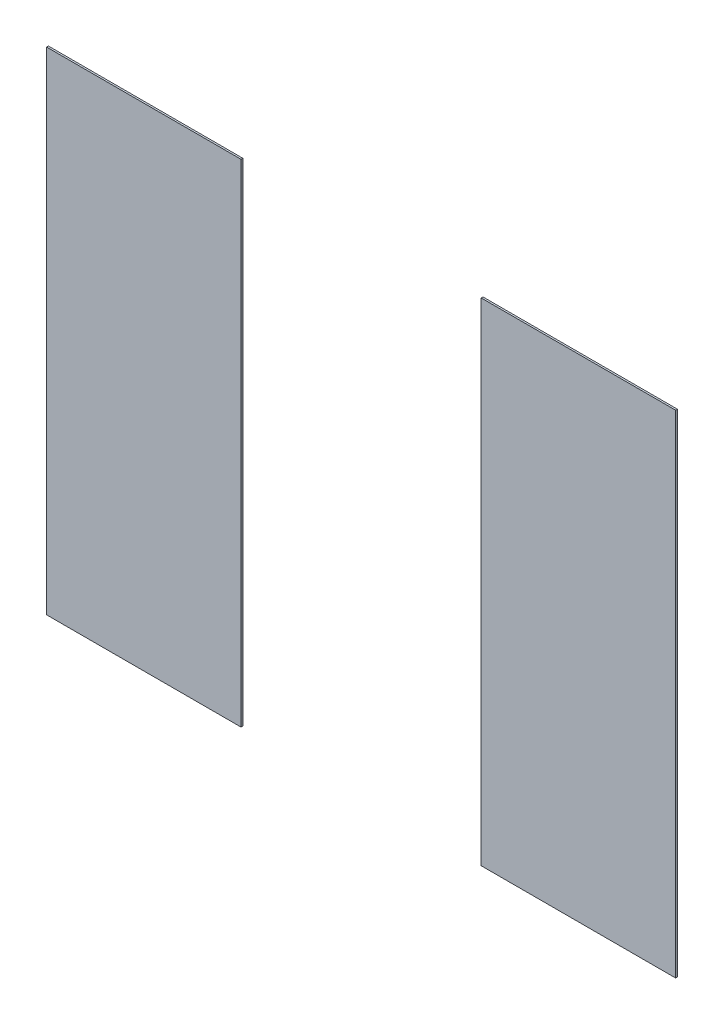
ISO-10303-21;
HEADER;
FILE_DESCRIPTION(('STEP AP214'),'2;1');
FILE_NAME('part.step','',(''),(''),'','','');
FILE_SCHEMA(('AUTOMOTIVE_DESIGN { 1 0 10303 214 1 1 1 1 }'));
ENDSEC;
DATA;
#1=APPLICATION_CONTEXT('core data for automotive mechanical design processes');
#2=APPLICATION_PROTOCOL_DEFINITION('international standard','automotive_design',2000,#1);
#3=PRODUCT_CONTEXT('',#1,'mechanical');
#4=PRODUCT('Part','Part','',(#3));
#5=PRODUCT_RELATED_PRODUCT_CATEGORY('part','',(#4));
#6=PRODUCT_DEFINITION_FORMATION('','',#4);
#7=PRODUCT_DEFINITION_CONTEXT('part definition',#1,'design');
#8=PRODUCT_DEFINITION('design','',#6,#7);
#9=PRODUCT_DEFINITION_SHAPE('','',#8);
#10=(LENGTH_UNIT() NAMED_UNIT(*) SI_UNIT(.MILLI.,.METRE.));
#11=(NAMED_UNIT(*) PLANE_ANGLE_UNIT() SI_UNIT($,.RADIAN.));
#12=(NAMED_UNIT(*) SI_UNIT($,.STERADIAN.) SOLID_ANGLE_UNIT());
#13=UNCERTAINTY_MEASURE_WITH_UNIT(LENGTH_MEASURE(1.E-05),#10,'distance_accuracy_value','');
#14=(GEOMETRIC_REPRESENTATION_CONTEXT(3) GLOBAL_UNCERTAINTY_ASSIGNED_CONTEXT((#13)) GLOBAL_UNIT_ASSIGNED_CONTEXT((#10,
#11,#12)) REPRESENTATION_CONTEXT('',''));
#15=CARTESIAN_POINT('',(0.,0.,0.));
#16=DIRECTION('',(0.,0.,1.));
#17=DIRECTION('',(1.,0.,0.));
#18=AXIS2_PLACEMENT_3D('',#15,#16,#17);
#19=CARTESIAN_POINT('',(3.4925,2.7305,0.02));
#20=DIRECTION('',(-1.,0.,0.));
#21=DIRECTION('',(0.,0.,1.));
#22=AXIS2_PLACEMENT_3D('',#19,#20,#21);
#23=PLANE('',#22);
#24=DIRECTION('',(0.,1.,0.));
#25=VECTOR('',#24,1.);
#26=CARTESIAN_POINT('',(3.4925,2.7305,0.));
#27=LINE('',#26,#25);
#28=CARTESIAN_POINT('',(3.4925,-2.7305,0.));
#29=VERTEX_POINT('',#28);
#30=CARTESIAN_POINT('',(3.4925,2.7305,0.));
#31=VERTEX_POINT('',#30);
#32=EDGE_CURVE('E103',#29,#31,#27,.T.);
#33=ORIENTED_EDGE('',*,*,#32,.T.);
#34=DIRECTION('',(0.,0.,-1.));
#35=VECTOR('',#34,1.);
#36=CARTESIAN_POINT('',(3.4925,2.7305,0.02));
#37=LINE('',#36,#35);
#38=CARTESIAN_POINT('',(3.4925,2.7305,0.02));
#39=VERTEX_POINT('',#38);
#40=EDGE_CURVE('E12',#39,#31,#37,.T.);
#41=ORIENTED_EDGE('',*,*,#40,.F.);
#42=DIRECTION('',(0.,1.,0.));
#43=VECTOR('',#42,1.);
#44=CARTESIAN_POINT('',(3.4925,2.7305,0.02));
#45=LINE('',#44,#43);
#46=CARTESIAN_POINT('',(3.4925,-2.7305,0.02));
#47=VERTEX_POINT('',#46);
#48=EDGE_CURVE('E91',#47,#39,#45,.T.);
#49=ORIENTED_EDGE('',*,*,#48,.F.);
#50=DIRECTION('',(0.,0.,-1.));
#51=VECTOR('',#50,1.);
#52=CARTESIAN_POINT('',(3.4925,-2.7305,0.02));
#53=LINE('',#52,#51);
#54=EDGE_CURVE('E99',#47,#29,#53,.T.);
#55=ORIENTED_EDGE('',*,*,#54,.T.);
#56=EDGE_LOOP('',(#33,#41,#49,#55));
#57=FACE_BOUND('',#56,.T.);
#58=ADVANCED_FACE('F40',(#57),#23,.F.);
#59=CARTESIAN_POINT('',(1.3335,2.7305,0.02));
#60=DIRECTION('',(0.,-1.,0.));
#61=DIRECTION('',(0.,0.,-1.));
#62=AXIS2_PLACEMENT_3D('',#59,#60,#61);
#63=PLANE('',#62);
#64=DIRECTION('',(-1.,0.,0.));
#65=VECTOR('',#64,1.);
#66=CARTESIAN_POINT('',(1.3335,2.7305,0.));
#67=LINE('',#66,#65);
#68=CARTESIAN_POINT('',(1.3335,2.7305,0.));
#69=VERTEX_POINT('',#68);
#70=EDGE_CURVE('E95',#31,#69,#67,.T.);
#71=ORIENTED_EDGE('',*,*,#70,.T.);
#72=DIRECTION('',(0.,0.,-1.));
#73=VECTOR('',#72,1.);
#74=CARTESIAN_POINT('',(1.3335,2.7305,0.02));
#75=LINE('',#74,#73);
#76=CARTESIAN_POINT('',(1.3335,2.7305,0.02));
#77=VERTEX_POINT('',#76);
#78=EDGE_CURVE('E48',#77,#69,#75,.T.);
#79=ORIENTED_EDGE('',*,*,#78,.F.);
#80=DIRECTION('',(-1.,0.,0.));
#81=VECTOR('',#80,1.);
#82=CARTESIAN_POINT('',(1.3335,2.7305,0.02));
#83=LINE('',#82,#81);
#84=EDGE_CURVE('E86',#39,#77,#83,.T.);
#85=ORIENTED_EDGE('',*,*,#84,.F.);
#86=ORIENTED_EDGE('',*,*,#40,.T.);
#87=EDGE_LOOP('',(#71,#79,#85,#86));
#88=FACE_BOUND('',#87,.T.);
#89=ADVANCED_FACE('F94',(#88),#63,.F.);
#90=CARTESIAN_POINT('',(1.3335,2.7305,0.02));
#91=DIRECTION('',(1.,0.,0.));
#92=DIRECTION('',(0.,0.,-1.));
#93=AXIS2_PLACEMENT_3D('',#90,#91,#92);
#94=PLANE('',#93);
#95=DIRECTION('',(0.,-1.,0.));
#96=VECTOR('',#95,1.);
#97=CARTESIAN_POINT('',(1.3335,2.7305,0.));
#98=LINE('',#97,#96);
#99=CARTESIAN_POINT('',(1.3335,-2.7305,0.));
#100=VERTEX_POINT('',#99);
#101=EDGE_CURVE('E73',#69,#100,#98,.T.);
#102=ORIENTED_EDGE('',*,*,#101,.T.);
#103=DIRECTION('',(0.,0.,-1.));
#104=VECTOR('',#103,1.);
#105=CARTESIAN_POINT('',(1.3335,-2.7305,0.02));
#106=LINE('',#105,#104);
#107=CARTESIAN_POINT('',(1.3335,-2.7305,0.02));
#108=VERTEX_POINT('',#107);
#109=EDGE_CURVE('E96',#108,#100,#106,.T.);
#110=ORIENTED_EDGE('',*,*,#109,.F.);
#111=DIRECTION('',(0.,-1.,0.));
#112=VECTOR('',#111,1.);
#113=CARTESIAN_POINT('',(1.3335,2.7305,0.02));
#114=LINE('',#113,#112);
#115=EDGE_CURVE('E89',#77,#108,#114,.T.);
#116=ORIENTED_EDGE('',*,*,#115,.F.);
#117=ORIENTED_EDGE('',*,*,#78,.T.);
#118=EDGE_LOOP('',(#102,#110,#116,#117));
#119=FACE_BOUND('',#118,.T.);
#120=ADVANCED_FACE('F97',(#119),#94,.F.);
#121=CARTESIAN_POINT('',(1.3335,-2.7305,0.02));
#122=DIRECTION('',(0.,1.,0.));
#123=DIRECTION('',(0.,0.,1.));
#124=AXIS2_PLACEMENT_3D('',#121,#122,#123);
#125=PLANE('',#124);
#126=DIRECTION('',(1.,0.,0.));
#127=VECTOR('',#126,1.);
#128=CARTESIAN_POINT('',(1.3335,-2.7305,0.));
#129=LINE('',#128,#127);
#130=EDGE_CURVE('E79',#100,#29,#129,.T.);
#131=ORIENTED_EDGE('',*,*,#130,.T.);
#132=ORIENTED_EDGE('',*,*,#54,.F.);
#133=DIRECTION('',(1.,0.,0.));
#134=VECTOR('',#133,1.);
#135=CARTESIAN_POINT('',(1.3335,-2.7305,0.02));
#136=LINE('',#135,#134);
#137=EDGE_CURVE('E56',#108,#47,#136,.T.);
#138=ORIENTED_EDGE('',*,*,#137,.F.);
#139=ORIENTED_EDGE('',*,*,#109,.T.);
#140=EDGE_LOOP('',(#131,#132,#138,#139));
#141=FACE_BOUND('',#140,.T.);
#142=ADVANCED_FACE('F110',(#141),#125,.F.);
#143=CARTESIAN_POINT('',(3.4925,-2.7305,0.02));
#144=DIRECTION('',(0.,0.,1.));
#145=DIRECTION('',(1.,0.,0.));
#146=AXIS2_PLACEMENT_3D('',#143,#144,#145);
#147=PLANE('',#146);
#148=ORIENTED_EDGE('',*,*,#48,.T.);
#149=ORIENTED_EDGE('',*,*,#84,.T.);
#150=ORIENTED_EDGE('',*,*,#115,.T.);
#151=ORIENTED_EDGE('',*,*,#137,.T.);
#152=EDGE_LOOP('',(#148,#149,#150,#151));
#153=FACE_BOUND('',#152,.T.);
#154=ADVANCED_FACE('F87',(#153),#147,.T.);
#155=CARTESIAN_POINT('',(3.4925,-2.7305,0.));
#156=DIRECTION('',(0.,0.,1.));
#157=DIRECTION('',(1.,0.,0.));
#158=AXIS2_PLACEMENT_3D('',#155,#156,#157);
#159=PLANE('',#158);
#160=ORIENTED_EDGE('',*,*,#32,.F.);
#161=ORIENTED_EDGE('',*,*,#130,.F.);
#162=ORIENTED_EDGE('',*,*,#101,.F.);
#163=ORIENTED_EDGE('',*,*,#70,.F.);
#164=EDGE_LOOP('',(#160,#161,#162,#163));
#165=FACE_BOUND('',#164,.T.);
#166=ADVANCED_FACE('F113',(#165),#159,.F.);
#167=CLOSED_SHELL('',(#58,#89,#120,#142,#154,#166));
#168=MANIFOLD_SOLID_BREP('B2',#167);
#169=CARTESIAN_POINT('',(-1.3335,2.7305,0.02));
#170=DIRECTION('',(-1.,0.,0.));
#171=DIRECTION('',(0.,0.,1.));
#172=AXIS2_PLACEMENT_3D('',#169,#170,#171);
#173=PLANE('',#172);
#174=DIRECTION('',(0.,1.,0.));
#175=VECTOR('',#174,1.);
#176=CARTESIAN_POINT('',(-1.3335,2.7305,0.));
#177=LINE('',#176,#175);
#178=CARTESIAN_POINT('',(-1.3335,-2.7305,0.));
#179=VERTEX_POINT('',#178);
#180=CARTESIAN_POINT('',(-1.3335,2.7305,0.));
#181=VERTEX_POINT('',#180);
#182=EDGE_CURVE('E226',#179,#181,#177,.T.);
#183=ORIENTED_EDGE('',*,*,#182,.T.);
#184=DIRECTION('',(0.,0.,-1.));
#185=VECTOR('',#184,1.);
#186=CARTESIAN_POINT('',(-1.3335,2.7305,0.02));
#187=LINE('',#186,#185);
#188=CARTESIAN_POINT('',(-1.3335,2.7305,0.02));
#189=VERTEX_POINT('',#188);
#190=EDGE_CURVE('E38',#189,#181,#187,.T.);
#191=ORIENTED_EDGE('',*,*,#190,.F.);
#192=DIRECTION('',(0.,1.,0.));
#193=VECTOR('',#192,1.);
#194=CARTESIAN_POINT('',(-1.3335,2.7305,0.02));
#195=LINE('',#194,#193);
#196=CARTESIAN_POINT('',(-1.3335,-2.7305,0.02));
#197=VERTEX_POINT('',#196);
#198=EDGE_CURVE('E214',#197,#189,#195,.T.);
#199=ORIENTED_EDGE('',*,*,#198,.F.);
#200=DIRECTION('',(0.,0.,-1.));
#201=VECTOR('',#200,1.);
#202=CARTESIAN_POINT('',(-1.3335,-2.7305,0.02));
#203=LINE('',#202,#201);
#204=EDGE_CURVE('E222',#197,#179,#203,.T.);
#205=ORIENTED_EDGE('',*,*,#204,.T.);
#206=EDGE_LOOP('',(#183,#191,#199,#205));
#207=FACE_BOUND('',#206,.T.);
#208=ADVANCED_FACE('F163',(#207),#173,.F.);
#209=CARTESIAN_POINT('',(-3.4925,2.7305,0.02));
#210=DIRECTION('',(0.,-1.,0.));
#211=DIRECTION('',(0.,0.,-1.));
#212=AXIS2_PLACEMENT_3D('',#209,#210,#211);
#213=PLANE('',#212);
#214=DIRECTION('',(-1.,0.,0.));
#215=VECTOR('',#214,1.);
#216=CARTESIAN_POINT('',(-3.4925,2.7305,0.));
#217=LINE('',#216,#215);
#218=CARTESIAN_POINT('',(-3.4925,2.7305,0.));
#219=VERTEX_POINT('',#218);
#220=EDGE_CURVE('E218',#181,#219,#217,.T.);
#221=ORIENTED_EDGE('',*,*,#220,.T.);
#222=DIRECTION('',(0.,0.,-1.));
#223=VECTOR('',#222,1.);
#224=CARTESIAN_POINT('',(-3.4925,2.7305,0.02));
#225=LINE('',#224,#223);
#226=CARTESIAN_POINT('',(-3.4925,2.7305,0.02));
#227=VERTEX_POINT('',#226);
#228=EDGE_CURVE('E171',#227,#219,#225,.T.);
#229=ORIENTED_EDGE('',*,*,#228,.F.);
#230=DIRECTION('',(-1.,0.,0.));
#231=VECTOR('',#230,1.);
#232=CARTESIAN_POINT('',(-3.4925,2.7305,0.02));
#233=LINE('',#232,#231);
#234=EDGE_CURVE('E209',#189,#227,#233,.T.);
#235=ORIENTED_EDGE('',*,*,#234,.F.);
#236=ORIENTED_EDGE('',*,*,#190,.T.);
#237=EDGE_LOOP('',(#221,#229,#235,#236));
#238=FACE_BOUND('',#237,.T.);
#239=ADVANCED_FACE('F217',(#238),#213,.F.);
#240=CARTESIAN_POINT('',(-3.4925,2.7305,0.02));
#241=DIRECTION('',(1.,0.,0.));
#242=DIRECTION('',(0.,0.,-1.));
#243=AXIS2_PLACEMENT_3D('',#240,#241,#242);
#244=PLANE('',#243);
#245=DIRECTION('',(0.,-1.,0.));
#246=VECTOR('',#245,1.);
#247=CARTESIAN_POINT('',(-3.4925,2.7305,0.));
#248=LINE('',#247,#246);
#249=CARTESIAN_POINT('',(-3.4925,-2.7305,0.));
#250=VERTEX_POINT('',#249);
#251=EDGE_CURVE('E196',#219,#250,#248,.T.);
#252=ORIENTED_EDGE('',*,*,#251,.T.);
#253=DIRECTION('',(0.,0.,-1.));
#254=VECTOR('',#253,1.);
#255=CARTESIAN_POINT('',(-3.4925,-2.7305,0.02));
#256=LINE('',#255,#254);
#257=CARTESIAN_POINT('',(-3.4925,-2.7305,0.02));
#258=VERTEX_POINT('',#257);
#259=EDGE_CURVE('E219',#258,#250,#256,.T.);
#260=ORIENTED_EDGE('',*,*,#259,.F.);
#261=DIRECTION('',(0.,-1.,0.));
#262=VECTOR('',#261,1.);
#263=CARTESIAN_POINT('',(-3.4925,2.7305,0.02));
#264=LINE('',#263,#262);
#265=EDGE_CURVE('E212',#227,#258,#264,.T.);
#266=ORIENTED_EDGE('',*,*,#265,.F.);
#267=ORIENTED_EDGE('',*,*,#228,.T.);
#268=EDGE_LOOP('',(#252,#260,#266,#267));
#269=FACE_BOUND('',#268,.T.);
#270=ADVANCED_FACE('F220',(#269),#244,.F.);
#271=CARTESIAN_POINT('',(-3.4925,-2.7305,0.02));
#272=DIRECTION('',(0.,1.,0.));
#273=DIRECTION('',(0.,0.,1.));
#274=AXIS2_PLACEMENT_3D('',#271,#272,#273);
#275=PLANE('',#274);
#276=DIRECTION('',(1.,0.,0.));
#277=VECTOR('',#276,1.);
#278=CARTESIAN_POINT('',(-3.4925,-2.7305,0.));
#279=LINE('',#278,#277);
#280=EDGE_CURVE('E202',#250,#179,#279,.T.);
#281=ORIENTED_EDGE('',*,*,#280,.T.);
#282=ORIENTED_EDGE('',*,*,#204,.F.);
#283=DIRECTION('',(1.,0.,0.));
#284=VECTOR('',#283,1.);
#285=CARTESIAN_POINT('',(-3.4925,-2.7305,0.02));
#286=LINE('',#285,#284);
#287=EDGE_CURVE('E179',#258,#197,#286,.T.);
#288=ORIENTED_EDGE('',*,*,#287,.F.);
#289=ORIENTED_EDGE('',*,*,#259,.T.);
#290=EDGE_LOOP('',(#281,#282,#288,#289));
#291=FACE_BOUND('',#290,.T.);
#292=ADVANCED_FACE('F233',(#291),#275,.F.);
#293=CARTESIAN_POINT('',(-1.3335,-2.7305,0.02));
#294=DIRECTION('',(0.,0.,1.));
#295=DIRECTION('',(1.,0.,0.));
#296=AXIS2_PLACEMENT_3D('',#293,#294,#295);
#297=PLANE('',#296);
#298=ORIENTED_EDGE('',*,*,#198,.T.);
#299=ORIENTED_EDGE('',*,*,#234,.T.);
#300=ORIENTED_EDGE('',*,*,#265,.T.);
#301=ORIENTED_EDGE('',*,*,#287,.T.);
#302=EDGE_LOOP('',(#298,#299,#300,#301));
#303=FACE_BOUND('',#302,.T.);
#304=ADVANCED_FACE('F210',(#303),#297,.T.);
#305=CARTESIAN_POINT('',(-1.3335,-2.7305,0.));
#306=DIRECTION('',(0.,0.,1.));
#307=DIRECTION('',(1.,0.,0.));
#308=AXIS2_PLACEMENT_3D('',#305,#306,#307);
#309=PLANE('',#308);
#310=ORIENTED_EDGE('',*,*,#182,.F.);
#311=ORIENTED_EDGE('',*,*,#280,.F.);
#312=ORIENTED_EDGE('',*,*,#251,.F.);
#313=ORIENTED_EDGE('',*,*,#220,.F.);
#314=EDGE_LOOP('',(#310,#311,#312,#313));
#315=FACE_BOUND('',#314,.T.);
#316=ADVANCED_FACE('F236',(#315),#309,.F.);
#317=CLOSED_SHELL('',(#208,#239,#270,#292,#304,#316));
#318=MANIFOLD_SOLID_BREP('B6',#317);
#319=ADVANCED_BREP_SHAPE_REPRESENTATION('',(#18,#168,#318),#14);
#320=SHAPE_DEFINITION_REPRESENTATION(#9,#319);
ENDSEC;
END-ISO-10303-21;
